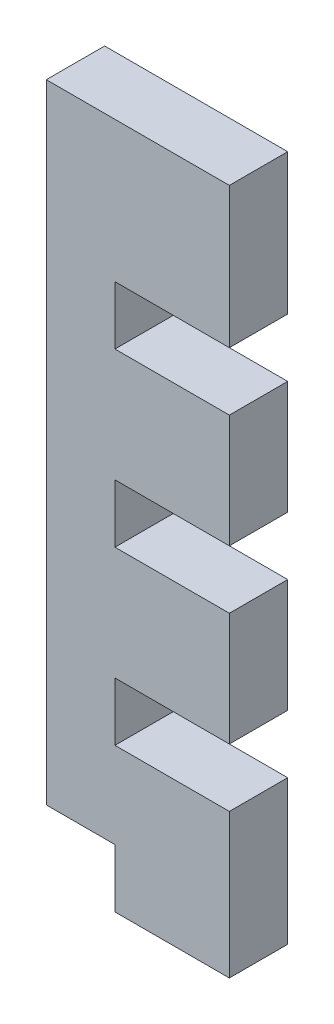
ISO-10303-21;
HEADER;
FILE_DESCRIPTION(('STEP AP214'),'2;1');
FILE_NAME('part.step','',(''),(''),'','','');
FILE_SCHEMA(('AUTOMOTIVE_DESIGN { 1 0 10303 214 1 1 1 1 }'));
ENDSEC;
DATA;
#1=APPLICATION_CONTEXT('core data for automotive mechanical design processes');
#2=APPLICATION_PROTOCOL_DEFINITION('international standard','automotive_design',2000,#1);
#3=PRODUCT_CONTEXT('',#1,'mechanical');
#4=PRODUCT('Part','Part','',(#3));
#5=PRODUCT_RELATED_PRODUCT_CATEGORY('part','',(#4));
#6=PRODUCT_DEFINITION_FORMATION('','',#4);
#7=PRODUCT_DEFINITION_CONTEXT('part definition',#1,'design');
#8=PRODUCT_DEFINITION('design','',#6,#7);
#9=PRODUCT_DEFINITION_SHAPE('','',#8);
#10=(LENGTH_UNIT() NAMED_UNIT(*) SI_UNIT(.MILLI.,.METRE.));
#11=(NAMED_UNIT(*) PLANE_ANGLE_UNIT() SI_UNIT($,.RADIAN.));
#12=(NAMED_UNIT(*) SI_UNIT($,.STERADIAN.) SOLID_ANGLE_UNIT());
#13=UNCERTAINTY_MEASURE_WITH_UNIT(LENGTH_MEASURE(1.E-05),#10,'distance_accuracy_value','');
#14=(GEOMETRIC_REPRESENTATION_CONTEXT(3) GLOBAL_UNCERTAINTY_ASSIGNED_CONTEXT((#13)) GLOBAL_UNIT_ASSIGNED_CONTEXT((#10,
#11,#12)) REPRESENTATION_CONTEXT('',''));
#15=CARTESIAN_POINT('',(0.,0.,0.));
#16=DIRECTION('',(0.,0.,1.));
#17=DIRECTION('',(1.,0.,0.));
#18=AXIS2_PLACEMENT_3D('',#15,#16,#17);
#19=CARTESIAN_POINT('',(-8.,-24.9,5.1));
#20=DIRECTION('',(1.,0.,0.));
#21=DIRECTION('',(0.,0.,-1.));
#22=AXIS2_PLACEMENT_3D('',#19,#20,#21);
#23=PLANE('',#22);
#24=DIRECTION('',(0.,-1.,0.));
#25=VECTOR('',#24,1.);
#26=CARTESIAN_POINT('',(-8.,-24.9,0.));
#27=LINE('',#26,#25);
#28=CARTESIAN_POINT('',(-8.,30.,0.));
#29=VERTEX_POINT('',#28);
#30=CARTESIAN_POINT('',(-8.,-24.9,0.));
#31=VERTEX_POINT('',#30);
#32=EDGE_CURVE('E189',#29,#31,#27,.T.);
#33=ORIENTED_EDGE('',*,*,#32,.T.);
#34=DIRECTION('',(0.,0.,-1.));
#35=VECTOR('',#34,1.);
#36=CARTESIAN_POINT('',(-8.,-24.9,5.1));
#37=LINE('',#36,#35);
#38=CARTESIAN_POINT('',(-8.,-24.9,5.1));
#39=VERTEX_POINT('',#38);
#40=EDGE_CURVE('E11',#39,#31,#37,.T.);
#41=ORIENTED_EDGE('',*,*,#40,.F.);
#42=DIRECTION('',(0.,-1.,0.));
#43=VECTOR('',#42,1.);
#44=CARTESIAN_POINT('',(-8.,-24.9,5.1));
#45=LINE('',#44,#43);
#46=CARTESIAN_POINT('',(-8.,30.,5.1));
#47=VERTEX_POINT('',#46);
#48=EDGE_CURVE('E223',#47,#39,#45,.T.);
#49=ORIENTED_EDGE('',*,*,#48,.F.);
#50=DIRECTION('',(0.,0.,-1.));
#51=VECTOR('',#50,1.);
#52=CARTESIAN_POINT('',(-8.,30.,5.1));
#53=LINE('',#52,#51);
#54=EDGE_CURVE('E185',#47,#29,#53,.T.);
#55=ORIENTED_EDGE('',*,*,#54,.T.);
#56=EDGE_LOOP('',(#33,#41,#49,#55));
#57=FACE_BOUND('',#56,.T.);
#58=ADVANCED_FACE('F33',(#57),#23,.F.);
#59=CARTESIAN_POINT('',(-8.,-24.9,5.1));
#60=DIRECTION('',(0.,1.,0.));
#61=DIRECTION('',(0.,0.,1.));
#62=AXIS2_PLACEMENT_3D('',#59,#60,#61);
#63=PLANE('',#62);
#64=DIRECTION('',(1.,0.,0.));
#65=VECTOR('',#64,1.);
#66=CARTESIAN_POINT('',(-8.,-24.9,0.));
#67=LINE('',#66,#65);
#68=CARTESIAN_POINT('',(-2.,-24.9,0.));
#69=VERTEX_POINT('',#68);
#70=EDGE_CURVE('E192',#31,#69,#67,.T.);
#71=ORIENTED_EDGE('',*,*,#70,.T.);
#72=DIRECTION('',(0.,0.,-1.));
#73=VECTOR('',#72,1.);
#74=CARTESIAN_POINT('',(-2.,-24.9,5.1));
#75=LINE('',#74,#73);
#76=CARTESIAN_POINT('',(-2.,-24.9,5.1));
#77=VERTEX_POINT('',#76);
#78=EDGE_CURVE('E41',#77,#69,#75,.T.);
#79=ORIENTED_EDGE('',*,*,#78,.F.);
#80=DIRECTION('',(1.,0.,0.));
#81=VECTOR('',#80,1.);
#82=CARTESIAN_POINT('',(-8.,-24.9,5.1));
#83=LINE('',#82,#81);
#84=EDGE_CURVE('E122',#39,#77,#83,.T.);
#85=ORIENTED_EDGE('',*,*,#84,.F.);
#86=ORIENTED_EDGE('',*,*,#40,.T.);
#87=EDGE_LOOP('',(#71,#79,#85,#86));
#88=FACE_BOUND('',#87,.T.);
#89=ADVANCED_FACE('F331',(#88),#63,.F.);
#90=CARTESIAN_POINT('',(-2.,-24.9,5.1));
#91=DIRECTION('',(1.,0.,0.));
#92=DIRECTION('',(0.,1.,0.));
#93=AXIS2_PLACEMENT_3D('',#90,#91,#92);
#94=PLANE('',#93);
#95=DIRECTION('',(0.,-1.,0.));
#96=VECTOR('',#95,1.);
#97=CARTESIAN_POINT('',(-2.,-24.9,0.));
#98=LINE('',#97,#96);
#99=CARTESIAN_POINT('',(-2.,-30.,0.));
#100=VERTEX_POINT('',#99);
#101=EDGE_CURVE('E194',#69,#100,#98,.T.);
#102=ORIENTED_EDGE('',*,*,#101,.T.);
#103=DIRECTION('',(0.,0.,-1.));
#104=VECTOR('',#103,1.);
#105=CARTESIAN_POINT('',(-2.,-30.,5.1));
#106=LINE('',#105,#104);
#107=CARTESIAN_POINT('',(-2.,-30.,5.1));
#108=VERTEX_POINT('',#107);
#109=EDGE_CURVE('E260',#108,#100,#106,.T.);
#110=ORIENTED_EDGE('',*,*,#109,.F.);
#111=DIRECTION('',(0.,-1.,0.));
#112=VECTOR('',#111,1.);
#113=CARTESIAN_POINT('',(-2.,-24.9,5.1));
#114=LINE('',#113,#112);
#115=EDGE_CURVE('E268',#77,#108,#114,.T.);
#116=ORIENTED_EDGE('',*,*,#115,.F.);
#117=ORIENTED_EDGE('',*,*,#78,.T.);
#118=EDGE_LOOP('',(#102,#110,#116,#117));
#119=FACE_BOUND('',#118,.T.);
#120=ADVANCED_FACE('F266',(#119),#94,.F.);
#121=CARTESIAN_POINT('',(8.,-30.,5.1));
#122=DIRECTION('',(0.,1.,0.));
#123=DIRECTION('',(0.,0.,1.));
#124=AXIS2_PLACEMENT_3D('',#121,#122,#123);
#125=PLANE('',#124);
#126=DIRECTION('',(1.,0.,0.));
#127=VECTOR('',#126,1.);
#128=CARTESIAN_POINT('',(8.,-30.,0.));
#129=LINE('',#128,#127);
#130=CARTESIAN_POINT('',(8.,-30.,0.));
#131=VERTEX_POINT('',#130);
#132=EDGE_CURVE('E196',#100,#131,#129,.T.);
#133=ORIENTED_EDGE('',*,*,#132,.T.);
#134=DIRECTION('',(0.,0.,-1.));
#135=VECTOR('',#134,1.);
#136=CARTESIAN_POINT('',(8.,-30.,5.1));
#137=LINE('',#136,#135);
#138=CARTESIAN_POINT('',(8.,-30.,5.1));
#139=VERTEX_POINT('',#138);
#140=EDGE_CURVE('E257',#139,#131,#137,.T.);
#141=ORIENTED_EDGE('',*,*,#140,.F.);
#142=DIRECTION('',(1.,0.,0.));
#143=VECTOR('',#142,1.);
#144=CARTESIAN_POINT('',(8.,-30.,5.1));
#145=LINE('',#144,#143);
#146=EDGE_CURVE('E286',#108,#139,#145,.T.);
#147=ORIENTED_EDGE('',*,*,#146,.F.);
#148=ORIENTED_EDGE('',*,*,#109,.T.);
#149=EDGE_LOOP('',(#133,#141,#147,#148));
#150=FACE_BOUND('',#149,.T.);
#151=ADVANCED_FACE('F277',(#150),#125,.F.);
#152=CARTESIAN_POINT('',(8.,-30.,5.1));
#153=DIRECTION('',(-1.,0.,0.));
#154=DIRECTION('',(0.,0.,1.));
#155=AXIS2_PLACEMENT_3D('',#152,#153,#154);
#156=PLANE('',#155);
#157=DIRECTION('',(0.,1.,0.));
#158=VECTOR('',#157,1.);
#159=CARTESIAN_POINT('',(8.,-30.,0.));
#160=LINE('',#159,#158);
#161=CARTESIAN_POINT('',(8.,-17.3883440402323,0.));
#162=VERTEX_POINT('',#161);
#163=EDGE_CURVE('E198',#131,#162,#160,.T.);
#164=ORIENTED_EDGE('',*,*,#163,.T.);
#165=DIRECTION('',(0.,0.,-1.));
#166=VECTOR('',#165,1.);
#167=CARTESIAN_POINT('',(8.,-17.3883440402323,5.1));
#168=LINE('',#167,#166);
#169=CARTESIAN_POINT('',(8.,-17.3883440402323,5.1));
#170=VERTEX_POINT('',#169);
#171=EDGE_CURVE('E254',#170,#162,#168,.T.);
#172=ORIENTED_EDGE('',*,*,#171,.F.);
#173=DIRECTION('',(0.,1.,0.));
#174=VECTOR('',#173,1.);
#175=CARTESIAN_POINT('',(8.,-30.,5.1));
#176=LINE('',#175,#174);
#177=EDGE_CURVE('E283',#139,#170,#176,.T.);
#178=ORIENTED_EDGE('',*,*,#177,.F.);
#179=ORIENTED_EDGE('',*,*,#140,.T.);
#180=EDGE_LOOP('',(#164,#172,#178,#179));
#181=FACE_BOUND('',#180,.T.);
#182=ADVANCED_FACE('F281',(#181),#156,.F.);
#183=CARTESIAN_POINT('',(8.,-17.3883440402323,5.1));
#184=DIRECTION('',(0.,-1.,0.));
#185=DIRECTION('',(0.,0.,-1.));
#186=AXIS2_PLACEMENT_3D('',#183,#184,#185);
#187=PLANE('',#186);
#188=DIRECTION('',(-1.,0.,0.));
#189=VECTOR('',#188,1.);
#190=CARTESIAN_POINT('',(8.,-17.3883440402323,0.));
#191=LINE('',#190,#189);
#192=CARTESIAN_POINT('',(-2.,-17.3883440402323,0.));
#193=VERTEX_POINT('',#192);
#194=EDGE_CURVE('E200',#162,#193,#191,.T.);
#195=ORIENTED_EDGE('',*,*,#194,.T.);
#196=DIRECTION('',(0.,0.,-1.));
#197=VECTOR('',#196,1.);
#198=CARTESIAN_POINT('',(-2.,-17.3883440402323,5.1));
#199=LINE('',#198,#197);
#200=CARTESIAN_POINT('',(-2.,-17.3883440402323,5.1));
#201=VERTEX_POINT('',#200);
#202=EDGE_CURVE('E251',#201,#193,#199,.T.);
#203=ORIENTED_EDGE('',*,*,#202,.F.);
#204=DIRECTION('',(-1.,0.,0.));
#205=VECTOR('',#204,1.);
#206=CARTESIAN_POINT('',(8.,-17.3883440402323,5.1));
#207=LINE('',#206,#205);
#208=EDGE_CURVE('E285',#170,#201,#207,.T.);
#209=ORIENTED_EDGE('',*,*,#208,.F.);
#210=ORIENTED_EDGE('',*,*,#171,.T.);
#211=EDGE_LOOP('',(#195,#203,#209,#210));
#212=FACE_BOUND('',#211,.T.);
#213=ADVANCED_FACE('F344',(#212),#187,.F.);
#214=CARTESIAN_POINT('',(-2.,-17.3883440402323,5.1));
#215=DIRECTION('',(-1.,0.,0.));
#216=DIRECTION('',(0.,0.,1.));
#217=AXIS2_PLACEMENT_3D('',#214,#215,#216);
#218=PLANE('',#217);
#219=DIRECTION('',(0.,1.,0.));
#220=VECTOR('',#219,1.);
#221=CARTESIAN_POINT('',(-2.,-17.3883440402323,0.));
#222=LINE('',#221,#220);
#223=CARTESIAN_POINT('',(-2.,-12.2883440402323,0.));
#224=VERTEX_POINT('',#223);
#225=EDGE_CURVE('E202',#193,#224,#222,.T.);
#226=ORIENTED_EDGE('',*,*,#225,.T.);
#227=DIRECTION('',(0.,0.,-1.));
#228=VECTOR('',#227,1.);
#229=CARTESIAN_POINT('',(-2.,-12.2883440402323,5.1));
#230=LINE('',#229,#228);
#231=CARTESIAN_POINT('',(-2.,-12.2883440402323,5.1));
#232=VERTEX_POINT('',#231);
#233=EDGE_CURVE('E248',#232,#224,#230,.T.);
#234=ORIENTED_EDGE('',*,*,#233,.F.);
#235=DIRECTION('',(0.,1.,0.));
#236=VECTOR('',#235,1.);
#237=CARTESIAN_POINT('',(-2.,-17.3883440402323,5.1));
#238=LINE('',#237,#236);
#239=EDGE_CURVE('E288',#201,#232,#238,.T.);
#240=ORIENTED_EDGE('',*,*,#239,.F.);
#241=ORIENTED_EDGE('',*,*,#202,.T.);
#242=EDGE_LOOP('',(#226,#234,#240,#241));
#243=FACE_BOUND('',#242,.T.);
#244=ADVANCED_FACE('F347',(#243),#218,.F.);
#245=CARTESIAN_POINT('',(8.,-12.2883440402323,5.1));
#246=DIRECTION('',(0.,1.,0.));
#247=DIRECTION('',(-1.,0.,0.));
#248=AXIS2_PLACEMENT_3D('',#245,#246,#247);
#249=PLANE('',#248);
#250=DIRECTION('',(1.,0.,0.));
#251=VECTOR('',#250,1.);
#252=CARTESIAN_POINT('',(8.,-12.2883440402323,0.));
#253=LINE('',#252,#251);
#254=CARTESIAN_POINT('',(8.,-12.2883440402323,0.));
#255=VERTEX_POINT('',#254);
#256=EDGE_CURVE('E204',#224,#255,#253,.T.);
#257=ORIENTED_EDGE('',*,*,#256,.T.);
#258=DIRECTION('',(0.,0.,-1.));
#259=VECTOR('',#258,1.);
#260=CARTESIAN_POINT('',(8.,-12.2883440402323,5.1));
#261=LINE('',#260,#259);
#262=CARTESIAN_POINT('',(8.,-12.2883440402323,5.1));
#263=VERTEX_POINT('',#262);
#264=EDGE_CURVE('E245',#263,#255,#261,.T.);
#265=ORIENTED_EDGE('',*,*,#264,.F.);
#266=DIRECTION('',(1.,0.,0.));
#267=VECTOR('',#266,1.);
#268=CARTESIAN_POINT('',(8.,-12.2883440402323,5.1));
#269=LINE('',#268,#267);
#270=EDGE_CURVE('E294',#232,#263,#269,.T.);
#271=ORIENTED_EDGE('',*,*,#270,.F.);
#272=ORIENTED_EDGE('',*,*,#233,.T.);
#273=EDGE_LOOP('',(#257,#265,#271,#272));
#274=FACE_BOUND('',#273,.T.);
#275=ADVANCED_FACE('F351',(#274),#249,.F.);
#276=CARTESIAN_POINT('',(8.,-12.2883440402323,5.1));
#277=DIRECTION('',(-1.,0.,0.));
#278=DIRECTION('',(0.,0.,1.));
#279=AXIS2_PLACEMENT_3D('',#276,#277,#278);
#280=PLANE('',#279);
#281=DIRECTION('',(0.,1.,0.));
#282=VECTOR('',#281,1.);
#283=CARTESIAN_POINT('',(8.,-12.2883440402323,0.));
#284=LINE('',#283,#282);
#285=CARTESIAN_POINT('',(8.,-2.38834404023235,0.));
#286=VERTEX_POINT('',#285);
#287=EDGE_CURVE('E206',#255,#286,#284,.T.);
#288=ORIENTED_EDGE('',*,*,#287,.T.);
#289=DIRECTION('',(0.,0.,-1.));
#290=VECTOR('',#289,1.);
#291=CARTESIAN_POINT('',(8.,-2.38834404023235,5.1));
#292=LINE('',#291,#290);
#293=CARTESIAN_POINT('',(8.,-2.38834404023235,5.1));
#294=VERTEX_POINT('',#293);
#295=EDGE_CURVE('E242',#294,#286,#292,.T.);
#296=ORIENTED_EDGE('',*,*,#295,.F.);
#297=DIRECTION('',(0.,1.,0.));
#298=VECTOR('',#297,1.);
#299=CARTESIAN_POINT('',(8.,-12.2883440402323,5.1));
#300=LINE('',#299,#298);
#301=EDGE_CURVE('E296',#263,#294,#300,.T.);
#302=ORIENTED_EDGE('',*,*,#301,.F.);
#303=ORIENTED_EDGE('',*,*,#264,.T.);
#304=EDGE_LOOP('',(#288,#296,#302,#303));
#305=FACE_BOUND('',#304,.T.);
#306=ADVANCED_FACE('F355',(#305),#280,.F.);
#307=CARTESIAN_POINT('',(8.,-2.38834404023235,5.1));
#308=DIRECTION('',(0.,-1.,0.));
#309=DIRECTION('',(0.,0.,-1.));
#310=AXIS2_PLACEMENT_3D('',#307,#308,#309);
#311=PLANE('',#310);
#312=DIRECTION('',(-1.,0.,0.));
#313=VECTOR('',#312,1.);
#314=CARTESIAN_POINT('',(8.,-2.38834404023235,0.));
#315=LINE('',#314,#313);
#316=CARTESIAN_POINT('',(-2.,-2.38834404023235,0.));
#317=VERTEX_POINT('',#316);
#318=EDGE_CURVE('E208',#286,#317,#315,.T.);
#319=ORIENTED_EDGE('',*,*,#318,.T.);
#320=DIRECTION('',(0.,0.,-1.));
#321=VECTOR('',#320,1.);
#322=CARTESIAN_POINT('',(-2.,-2.38834404023235,5.1));
#323=LINE('',#322,#321);
#324=CARTESIAN_POINT('',(-2.,-2.38834404023235,5.1));
#325=VERTEX_POINT('',#324);
#326=EDGE_CURVE('E239',#325,#317,#323,.T.);
#327=ORIENTED_EDGE('',*,*,#326,.F.);
#328=DIRECTION('',(-1.,0.,0.));
#329=VECTOR('',#328,1.);
#330=CARTESIAN_POINT('',(8.,-2.38834404023235,5.1));
#331=LINE('',#330,#329);
#332=EDGE_CURVE('E298',#294,#325,#331,.T.);
#333=ORIENTED_EDGE('',*,*,#332,.F.);
#334=ORIENTED_EDGE('',*,*,#295,.T.);
#335=EDGE_LOOP('',(#319,#327,#333,#334));
#336=FACE_BOUND('',#335,.T.);
#337=ADVANCED_FACE('F359',(#336),#311,.F.);
#338=CARTESIAN_POINT('',(-2.,-2.38834404023235,5.1));
#339=DIRECTION('',(-1.,0.,0.));
#340=DIRECTION('',(0.,0.,1.));
#341=AXIS2_PLACEMENT_3D('',#338,#339,#340);
#342=PLANE('',#341);
#343=DIRECTION('',(0.,1.,0.));
#344=VECTOR('',#343,1.);
#345=CARTESIAN_POINT('',(-2.,-2.38834404023235,0.));
#346=LINE('',#345,#344);
#347=CARTESIAN_POINT('',(-2.,2.71165595976765,0.));
#348=VERTEX_POINT('',#347);
#349=EDGE_CURVE('E210',#317,#348,#346,.T.);
#350=ORIENTED_EDGE('',*,*,#349,.T.);
#351=DIRECTION('',(0.,0.,-1.));
#352=VECTOR('',#351,1.);
#353=CARTESIAN_POINT('',(-2.,2.71165595976765,5.1));
#354=LINE('',#353,#352);
#355=CARTESIAN_POINT('',(-2.,2.71165595976765,5.1));
#356=VERTEX_POINT('',#355);
#357=EDGE_CURVE('E236',#356,#348,#354,.T.);
#358=ORIENTED_EDGE('',*,*,#357,.F.);
#359=DIRECTION('',(0.,1.,0.));
#360=VECTOR('',#359,1.);
#361=CARTESIAN_POINT('',(-2.,-2.38834404023235,5.1));
#362=LINE('',#361,#360);
#363=EDGE_CURVE('E300',#325,#356,#362,.T.);
#364=ORIENTED_EDGE('',*,*,#363,.F.);
#365=ORIENTED_EDGE('',*,*,#326,.T.);
#366=EDGE_LOOP('',(#350,#358,#364,#365));
#367=FACE_BOUND('',#366,.T.);
#368=ADVANCED_FACE('F363',(#367),#342,.F.);
#369=CARTESIAN_POINT('',(8.,2.71165595976765,5.1));
#370=DIRECTION('',(0.,1.,0.));
#371=DIRECTION('',(-1.,0.,0.));
#372=AXIS2_PLACEMENT_3D('',#369,#370,#371);
#373=PLANE('',#372);
#374=DIRECTION('',(1.,0.,0.));
#375=VECTOR('',#374,1.);
#376=CARTESIAN_POINT('',(8.,2.71165595976765,0.));
#377=LINE('',#376,#375);
#378=CARTESIAN_POINT('',(8.,2.71165595976765,0.));
#379=VERTEX_POINT('',#378);
#380=EDGE_CURVE('E212',#348,#379,#377,.T.);
#381=ORIENTED_EDGE('',*,*,#380,.T.);
#382=DIRECTION('',(0.,0.,-1.));
#383=VECTOR('',#382,1.);
#384=CARTESIAN_POINT('',(8.,2.71165595976765,5.1));
#385=LINE('',#384,#383);
#386=CARTESIAN_POINT('',(8.,2.71165595976765,5.1));
#387=VERTEX_POINT('',#386);
#388=EDGE_CURVE('E233',#387,#379,#385,.T.);
#389=ORIENTED_EDGE('',*,*,#388,.F.);
#390=DIRECTION('',(1.,0.,0.));
#391=VECTOR('',#390,1.);
#392=CARTESIAN_POINT('',(8.,2.71165595976765,5.1));
#393=LINE('',#392,#391);
#394=EDGE_CURVE('E302',#356,#387,#393,.T.);
#395=ORIENTED_EDGE('',*,*,#394,.F.);
#396=ORIENTED_EDGE('',*,*,#357,.T.);
#397=EDGE_LOOP('',(#381,#389,#395,#396));
#398=FACE_BOUND('',#397,.T.);
#399=ADVANCED_FACE('F367',(#398),#373,.F.);
#400=CARTESIAN_POINT('',(8.,2.71165595976765,5.1));
#401=DIRECTION('',(-1.,0.,0.));
#402=DIRECTION('',(0.,0.,1.));
#403=AXIS2_PLACEMENT_3D('',#400,#401,#402);
#404=PLANE('',#403);
#405=DIRECTION('',(0.,1.,0.));
#406=VECTOR('',#405,1.);
#407=CARTESIAN_POINT('',(8.,2.71165595976765,0.));
#408=LINE('',#407,#406);
#409=CARTESIAN_POINT('',(8.,12.6116559597677,0.));
#410=VERTEX_POINT('',#409);
#411=EDGE_CURVE('E214',#379,#410,#408,.T.);
#412=ORIENTED_EDGE('',*,*,#411,.T.);
#413=DIRECTION('',(0.,0.,-1.));
#414=VECTOR('',#413,1.);
#415=CARTESIAN_POINT('',(8.,12.6116559597677,5.1));
#416=LINE('',#415,#414);
#417=CARTESIAN_POINT('',(8.,12.6116559597677,5.1));
#418=VERTEX_POINT('',#417);
#419=EDGE_CURVE('E230',#418,#410,#416,.T.);
#420=ORIENTED_EDGE('',*,*,#419,.F.);
#421=DIRECTION('',(0.,1.,0.));
#422=VECTOR('',#421,1.);
#423=CARTESIAN_POINT('',(8.,2.71165595976765,5.1));
#424=LINE('',#423,#422);
#425=EDGE_CURVE('E304',#387,#418,#424,.T.);
#426=ORIENTED_EDGE('',*,*,#425,.F.);
#427=ORIENTED_EDGE('',*,*,#388,.T.);
#428=EDGE_LOOP('',(#412,#420,#426,#427));
#429=FACE_BOUND('',#428,.T.);
#430=ADVANCED_FACE('F371',(#429),#404,.F.);
#431=CARTESIAN_POINT('',(8.,12.6116559597677,5.1));
#432=DIRECTION('',(0.,-1.,0.));
#433=DIRECTION('',(0.,0.,-1.));
#434=AXIS2_PLACEMENT_3D('',#431,#432,#433);
#435=PLANE('',#434);
#436=DIRECTION('',(-1.,0.,0.));
#437=VECTOR('',#436,1.);
#438=CARTESIAN_POINT('',(8.,12.6116559597677,0.));
#439=LINE('',#438,#437);
#440=CARTESIAN_POINT('',(-2.,12.6116559597677,0.));
#441=VERTEX_POINT('',#440);
#442=EDGE_CURVE('E216',#410,#441,#439,.T.);
#443=ORIENTED_EDGE('',*,*,#442,.T.);
#444=DIRECTION('',(0.,0.,-1.));
#445=VECTOR('',#444,1.);
#446=CARTESIAN_POINT('',(-2.,12.6116559597677,5.1));
#447=LINE('',#446,#445);
#448=CARTESIAN_POINT('',(-2.,12.6116559597677,5.1));
#449=VERTEX_POINT('',#448);
#450=EDGE_CURVE('E227',#449,#441,#447,.T.);
#451=ORIENTED_EDGE('',*,*,#450,.F.);
#452=DIRECTION('',(-1.,0.,0.));
#453=VECTOR('',#452,1.);
#454=CARTESIAN_POINT('',(8.,12.6116559597677,5.1));
#455=LINE('',#454,#453);
#456=EDGE_CURVE('E306',#418,#449,#455,.T.);
#457=ORIENTED_EDGE('',*,*,#456,.F.);
#458=ORIENTED_EDGE('',*,*,#419,.T.);
#459=EDGE_LOOP('',(#443,#451,#457,#458));
#460=FACE_BOUND('',#459,.T.);
#461=ADVANCED_FACE('F312',(#460),#435,.F.);
#462=CARTESIAN_POINT('',(-2.,12.6116559597677,5.1));
#463=DIRECTION('',(-1.,0.,0.));
#464=DIRECTION('',(0.,0.,1.));
#465=AXIS2_PLACEMENT_3D('',#462,#463,#464);
#466=PLANE('',#465);
#467=DIRECTION('',(0.,1.,0.));
#468=VECTOR('',#467,1.);
#469=CARTESIAN_POINT('',(-2.,12.6116559597677,0.));
#470=LINE('',#469,#468);
#471=CARTESIAN_POINT('',(-2.,17.7116559597677,0.));
#472=VERTEX_POINT('',#471);
#473=EDGE_CURVE('E218',#441,#472,#470,.T.);
#474=ORIENTED_EDGE('',*,*,#473,.T.);
#475=DIRECTION('',(0.,0.,-1.));
#476=VECTOR('',#475,1.);
#477=CARTESIAN_POINT('',(-2.,17.7116559597677,5.1));
#478=LINE('',#477,#476);
#479=CARTESIAN_POINT('',(-2.,17.7116559597677,5.1));
#480=VERTEX_POINT('',#479);
#481=EDGE_CURVE('E180',#480,#472,#478,.T.);
#482=ORIENTED_EDGE('',*,*,#481,.F.);
#483=DIRECTION('',(0.,1.,0.));
#484=VECTOR('',#483,1.);
#485=CARTESIAN_POINT('',(-2.,12.6116559597677,5.1));
#486=LINE('',#485,#484);
#487=EDGE_CURVE('E171',#449,#480,#486,.T.);
#488=ORIENTED_EDGE('',*,*,#487,.F.);
#489=ORIENTED_EDGE('',*,*,#450,.T.);
#490=EDGE_LOOP('',(#474,#482,#488,#489));
#491=FACE_BOUND('',#490,.T.);
#492=ADVANCED_FACE('F316',(#491),#466,.F.);
#493=CARTESIAN_POINT('',(8.,17.7116559597677,5.1));
#494=DIRECTION('',(0.,1.,0.));
#495=DIRECTION('',(0.,0.,1.));
#496=AXIS2_PLACEMENT_3D('',#493,#494,#495);
#497=PLANE('',#496);
#498=DIRECTION('',(1.,0.,0.));
#499=VECTOR('',#498,1.);
#500=CARTESIAN_POINT('',(8.,17.7116559597677,0.));
#501=LINE('',#500,#499);
#502=CARTESIAN_POINT('',(8.,17.7116559597677,0.));
#503=VERTEX_POINT('',#502);
#504=EDGE_CURVE('E179',#472,#503,#501,.T.);
#505=ORIENTED_EDGE('',*,*,#504,.T.);
#506=DIRECTION('',(0.,0.,-1.));
#507=VECTOR('',#506,1.);
#508=CARTESIAN_POINT('',(8.,17.7116559597677,5.1));
#509=LINE('',#508,#507);
#510=CARTESIAN_POINT('',(8.,17.7116559597677,5.1));
#511=VERTEX_POINT('',#510);
#512=EDGE_CURVE('E176',#511,#503,#509,.T.);
#513=ORIENTED_EDGE('',*,*,#512,.F.);
#514=DIRECTION('',(1.,0.,0.));
#515=VECTOR('',#514,1.);
#516=CARTESIAN_POINT('',(8.,17.7116559597677,5.1));
#517=LINE('',#516,#515);
#518=EDGE_CURVE('E165',#480,#511,#517,.T.);
#519=ORIENTED_EDGE('',*,*,#518,.F.);
#520=ORIENTED_EDGE('',*,*,#481,.T.);
#521=EDGE_LOOP('',(#505,#513,#519,#520));
#522=FACE_BOUND('',#521,.T.);
#523=ADVANCED_FACE('F177',(#522),#497,.F.);
#524=CARTESIAN_POINT('',(8.,17.7116559597677,5.1));
#525=DIRECTION('',(-1.,0.,0.));
#526=DIRECTION('',(0.,0.,1.));
#527=AXIS2_PLACEMENT_3D('',#524,#525,#526);
#528=PLANE('',#527);
#529=DIRECTION('',(0.,1.,0.));
#530=VECTOR('',#529,1.);
#531=CARTESIAN_POINT('',(8.,17.7116559597677,0.));
#532=LINE('',#531,#530);
#533=CARTESIAN_POINT('',(8.,30.,0.));
#534=VERTEX_POINT('',#533);
#535=EDGE_CURVE('E108',#503,#534,#532,.T.);
#536=ORIENTED_EDGE('',*,*,#535,.T.);
#537=DIRECTION('',(0.,0.,-1.));
#538=VECTOR('',#537,1.);
#539=CARTESIAN_POINT('',(8.,30.,5.1));
#540=LINE('',#539,#538);
#541=CARTESIAN_POINT('',(8.,30.,5.1));
#542=VERTEX_POINT('',#541);
#543=EDGE_CURVE('E181',#542,#534,#540,.T.);
#544=ORIENTED_EDGE('',*,*,#543,.F.);
#545=DIRECTION('',(0.,1.,0.));
#546=VECTOR('',#545,1.);
#547=CARTESIAN_POINT('',(8.,17.7116559597677,5.1));
#548=LINE('',#547,#546);
#549=EDGE_CURVE('E169',#511,#542,#548,.T.);
#550=ORIENTED_EDGE('',*,*,#549,.F.);
#551=ORIENTED_EDGE('',*,*,#512,.T.);
#552=EDGE_LOOP('',(#536,#544,#550,#551));
#553=FACE_BOUND('',#552,.T.);
#554=ADVANCED_FACE('F183',(#553),#528,.F.);
#555=CARTESIAN_POINT('',(8.,30.,5.1));
#556=DIRECTION('',(0.,-1.,0.));
#557=DIRECTION('',(0.,0.,-1.));
#558=AXIS2_PLACEMENT_3D('',#555,#556,#557);
#559=PLANE('',#558);
#560=DIRECTION('',(-1.,0.,0.));
#561=VECTOR('',#560,1.);
#562=CARTESIAN_POINT('',(8.,30.,0.));
#563=LINE('',#562,#561);
#564=EDGE_CURVE('E114',#534,#29,#563,.T.);
#565=ORIENTED_EDGE('',*,*,#564,.T.);
#566=ORIENTED_EDGE('',*,*,#54,.F.);
#567=DIRECTION('',(-1.,0.,0.));
#568=VECTOR('',#567,1.);
#569=CARTESIAN_POINT('',(8.,30.,5.1));
#570=LINE('',#569,#568);
#571=EDGE_CURVE('E49',#542,#47,#570,.T.);
#572=ORIENTED_EDGE('',*,*,#571,.F.);
#573=ORIENTED_EDGE('',*,*,#543,.T.);
#574=EDGE_LOOP('',(#565,#566,#572,#573));
#575=FACE_BOUND('',#574,.T.);
#576=ADVANCED_FACE('F320',(#575),#559,.F.);
#577=CARTESIAN_POINT('',(0.,0.,5.1));
#578=DIRECTION('',(0.,0.,1.));
#579=DIRECTION('',(1.,0.,0.));
#580=AXIS2_PLACEMENT_3D('',#577,#578,#579);
#581=PLANE('',#580);
#582=ORIENTED_EDGE('',*,*,#48,.T.);
#583=ORIENTED_EDGE('',*,*,#84,.T.);
#584=ORIENTED_EDGE('',*,*,#115,.T.);
#585=ORIENTED_EDGE('',*,*,#146,.T.);
#586=ORIENTED_EDGE('',*,*,#177,.T.);
#587=ORIENTED_EDGE('',*,*,#208,.T.);
#588=ORIENTED_EDGE('',*,*,#239,.T.);
#589=ORIENTED_EDGE('',*,*,#270,.T.);
#590=ORIENTED_EDGE('',*,*,#301,.T.);
#591=ORIENTED_EDGE('',*,*,#332,.T.);
#592=ORIENTED_EDGE('',*,*,#363,.T.);
#593=ORIENTED_EDGE('',*,*,#394,.T.);
#594=ORIENTED_EDGE('',*,*,#425,.T.);
#595=ORIENTED_EDGE('',*,*,#456,.T.);
#596=ORIENTED_EDGE('',*,*,#487,.T.);
#597=ORIENTED_EDGE('',*,*,#518,.T.);
#598=ORIENTED_EDGE('',*,*,#549,.T.);
#599=ORIENTED_EDGE('',*,*,#571,.T.);
#600=EDGE_LOOP('',(#582,#583,#584,#585,#586,#587,#588,#589,#590,#591,#592,#593,#594,#595,#596,
#597,#598,#599));
#601=FACE_BOUND('',#600,.T.);
#602=ADVANCED_FACE('F167',(#601),#581,.T.);
#603=CARTESIAN_POINT('',(0.,0.,0.));
#604=DIRECTION('',(0.,0.,1.));
#605=DIRECTION('',(1.,0.,0.));
#606=AXIS2_PLACEMENT_3D('',#603,#604,#605);
#607=PLANE('',#606);
#608=ORIENTED_EDGE('',*,*,#32,.F.);
#609=ORIENTED_EDGE('',*,*,#564,.F.);
#610=ORIENTED_EDGE('',*,*,#535,.F.);
#611=ORIENTED_EDGE('',*,*,#504,.F.);
#612=ORIENTED_EDGE('',*,*,#473,.F.);
#613=ORIENTED_EDGE('',*,*,#442,.F.);
#614=ORIENTED_EDGE('',*,*,#411,.F.);
#615=ORIENTED_EDGE('',*,*,#380,.F.);
#616=ORIENTED_EDGE('',*,*,#349,.F.);
#617=ORIENTED_EDGE('',*,*,#318,.F.);
#618=ORIENTED_EDGE('',*,*,#287,.F.);
#619=ORIENTED_EDGE('',*,*,#256,.F.);
#620=ORIENTED_EDGE('',*,*,#225,.F.);
#621=ORIENTED_EDGE('',*,*,#194,.F.);
#622=ORIENTED_EDGE('',*,*,#163,.F.);
#623=ORIENTED_EDGE('',*,*,#132,.F.);
#624=ORIENTED_EDGE('',*,*,#101,.F.);
#625=ORIENTED_EDGE('',*,*,#70,.F.);
#626=EDGE_LOOP('',(#608,#609,#610,#611,#612,#613,#614,#615,#616,#617,#618,#619,#620,#621,#622,
#623,#624,#625));
#627=FACE_BOUND('',#626,.T.);
#628=ADVANCED_FACE('F272',(#627),#607,.F.);
#629=CLOSED_SHELL('',(#58,#89,#120,#151,#182,#213,#244,#275,#306,#337,#368,#399,#430,#461,#492,
#523,#554,#576,#602,#628));
#630=MANIFOLD_SOLID_BREP('B2',#629);
#631=ADVANCED_BREP_SHAPE_REPRESENTATION('',(#18,#630),#14);
#632=SHAPE_DEFINITION_REPRESENTATION(#9,#631);
ENDSEC;
END-ISO-10303-21;
